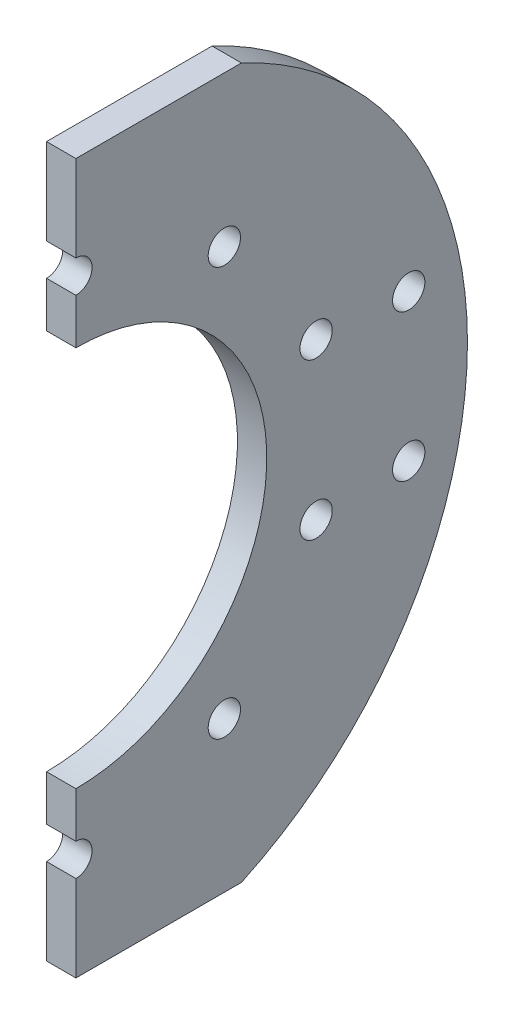
ISO-10303-21;
HEADER;
FILE_DESCRIPTION(('STEP AP214'),'2;1');
FILE_NAME('part.step','',(''),(''),'','','');
FILE_SCHEMA(('AUTOMOTIVE_DESIGN { 1 0 10303 214 1 1 1 1 }'));
ENDSEC;
DATA;
#1=APPLICATION_CONTEXT('core data for automotive mechanical design processes');
#2=APPLICATION_PROTOCOL_DEFINITION('international standard','automotive_design',2000,#1);
#3=PRODUCT_CONTEXT('',#1,'mechanical');
#4=PRODUCT('Part','Part','',(#3));
#5=PRODUCT_RELATED_PRODUCT_CATEGORY('part','',(#4));
#6=PRODUCT_DEFINITION_FORMATION('','',#4);
#7=PRODUCT_DEFINITION_CONTEXT('part definition',#1,'design');
#8=PRODUCT_DEFINITION('design','',#6,#7);
#9=PRODUCT_DEFINITION_SHAPE('','',#8);
#10=(LENGTH_UNIT() NAMED_UNIT(*) SI_UNIT(.MILLI.,.METRE.));
#11=(NAMED_UNIT(*) PLANE_ANGLE_UNIT() SI_UNIT($,.RADIAN.));
#12=(NAMED_UNIT(*) SI_UNIT($,.STERADIAN.) SOLID_ANGLE_UNIT());
#13=UNCERTAINTY_MEASURE_WITH_UNIT(LENGTH_MEASURE(1.E-05),#10,'distance_accuracy_value','');
#14=(GEOMETRIC_REPRESENTATION_CONTEXT(3) GLOBAL_UNCERTAINTY_ASSIGNED_CONTEXT((#13)) GLOBAL_UNIT_ASSIGNED_CONTEXT((#10,
#11,#12)) REPRESENTATION_CONTEXT('',''));
#15=CARTESIAN_POINT('',(0.,0.,0.));
#16=DIRECTION('',(0.,0.,1.));
#17=DIRECTION('',(1.,0.,0.));
#18=AXIS2_PLACEMENT_3D('',#15,#16,#17);
#19=CARTESIAN_POINT('',(0.,0.,0.));
#20=DIRECTION('',(0.,0.,1.));
#21=DIRECTION('',(1.,0.,0.));
#22=AXIS2_PLACEMENT_3D('',#19,#20,#21);
#23=PLANE('',#22);
#24=DIRECTION('',(0.,-1.,0.));
#25=VECTOR('',#24,1.);
#26=CARTESIAN_POINT('',(6.,0.,0.));
#27=LINE('',#26,#25);
#28=CARTESIAN_POINT('',(6.,72.5,0.));
#29=VERTEX_POINT('',#28);
#30=CARTESIAN_POINT('',(6.,54.9,0.));
#31=VERTEX_POINT('',#30);
#32=EDGE_CURVE('E73',#29,#31,#27,.T.);
#33=ORIENTED_EDGE('',*,*,#32,.F.);
#34=DIRECTION('',(1.,0.,0.));
#35=VECTOR('',#34,1.);
#36=CARTESIAN_POINT('',(6.,72.5,0.));
#37=LINE('',#36,#35);
#38=CARTESIAN_POINT('',(0.,72.5,0.));
#39=VERTEX_POINT('',#38);
#40=EDGE_CURVE('E139',#39,#29,#37,.T.);
#41=ORIENTED_EDGE('',*,*,#40,.F.);
#42=DIRECTION('',(0.,-1.,0.));
#43=VECTOR('',#42,1.);
#44=CARTESIAN_POINT('',(0.,0.,0.));
#45=LINE('',#44,#43);
#46=CARTESIAN_POINT('',(0.,54.9,0.));
#47=VERTEX_POINT('',#46);
#48=EDGE_CURVE('E123',#39,#47,#45,.T.);
#49=ORIENTED_EDGE('',*,*,#48,.T.);
#50=DIRECTION('',(-1.,0.,0.));
#51=VECTOR('',#50,1.);
#52=CARTESIAN_POINT('',(6.,54.9,0.));
#53=LINE('',#52,#51);
#54=EDGE_CURVE('E131',#31,#47,#53,.T.);
#55=ORIENTED_EDGE('',*,*,#54,.F.);
#56=EDGE_LOOP('',(#33,#41,#49,#55));
#57=FACE_BOUND('',#56,.T.);
#58=ADVANCED_FACE('F34',(#57),#23,.T.);
#59=CARTESIAN_POINT('',(6.,48.3,0.));
#60=VERTEX_POINT('',#59);
#61=CARTESIAN_POINT('',(6.,39.,0.));
#62=VERTEX_POINT('',#61);
#63=EDGE_CURVE('E234',#60,#62,#27,.T.);
#64=ORIENTED_EDGE('',*,*,#63,.F.);
#65=DIRECTION('',(-1.,0.,0.));
#66=VECTOR('',#65,1.);
#67=CARTESIAN_POINT('',(6.,48.3,0.));
#68=LINE('',#67,#66);
#69=CARTESIAN_POINT('',(0.,48.3,0.));
#70=VERTEX_POINT('',#69);
#71=EDGE_CURVE('E135',#70,#60,#68,.F.);
#72=ORIENTED_EDGE('',*,*,#71,.F.);
#73=CARTESIAN_POINT('',(0.,39.,0.));
#74=VERTEX_POINT('',#73);
#75=EDGE_CURVE('E125',#70,#74,#45,.T.);
#76=ORIENTED_EDGE('',*,*,#75,.T.);
#77=DIRECTION('',(-1.,0.,0.));
#78=VECTOR('',#77,1.);
#79=CARTESIAN_POINT('',(6.,39.,0.));
#80=LINE('',#79,#78);
#81=EDGE_CURVE('E173',#62,#74,#80,.T.);
#82=ORIENTED_EDGE('',*,*,#81,.F.);
#83=EDGE_LOOP('',(#64,#72,#76,#82));
#84=FACE_BOUND('',#83,.T.);
#85=ADVANCED_FACE('F240',(#84),#23,.T.);
#86=CARTESIAN_POINT('',(6.,-39.,0.));
#87=VERTEX_POINT('',#86);
#88=CARTESIAN_POINT('',(6.,-48.3,0.));
#89=VERTEX_POINT('',#88);
#90=EDGE_CURVE('E239',#87,#89,#27,.T.);
#91=ORIENTED_EDGE('',*,*,#90,.F.);
#92=DIRECTION('',(-1.,0.,0.));
#93=VECTOR('',#92,1.);
#94=CARTESIAN_POINT('',(6.,-39.,0.));
#95=LINE('',#94,#93);
#96=CARTESIAN_POINT('',(0.,-39.,0.));
#97=VERTEX_POINT('',#96);
#98=EDGE_CURVE('E161',#97,#87,#95,.F.);
#99=ORIENTED_EDGE('',*,*,#98,.F.);
#100=CARTESIAN_POINT('',(0.,-48.3,0.));
#101=VERTEX_POINT('',#100);
#102=EDGE_CURVE('E145',#97,#101,#45,.T.);
#103=ORIENTED_EDGE('',*,*,#102,.T.);
#104=DIRECTION('',(-1.,0.,0.));
#105=VECTOR('',#104,1.);
#106=CARTESIAN_POINT('',(6.,-48.3,0.));
#107=LINE('',#106,#105);
#108=EDGE_CURVE('E158',#89,#101,#107,.T.);
#109=ORIENTED_EDGE('',*,*,#108,.F.);
#110=EDGE_LOOP('',(#91,#99,#103,#109));
#111=FACE_BOUND('',#110,.T.);
#112=ADVANCED_FACE('F156',(#111),#23,.T.);
#113=CARTESIAN_POINT('',(6.,-54.9,0.));
#114=VERTEX_POINT('',#113);
#115=CARTESIAN_POINT('',(6.,-72.5,0.));
#116=VERTEX_POINT('',#115);
#117=EDGE_CURVE('E235',#114,#116,#27,.T.);
#118=ORIENTED_EDGE('',*,*,#117,.F.);
#119=DIRECTION('',(-1.,0.,0.));
#120=VECTOR('',#119,1.);
#121=CARTESIAN_POINT('',(6.,-54.9,0.));
#122=LINE('',#121,#120);
#123=CARTESIAN_POINT('',(0.,-54.9,0.));
#124=VERTEX_POINT('',#123);
#125=EDGE_CURVE('E136',#124,#114,#122,.F.);
#126=ORIENTED_EDGE('',*,*,#125,.F.);
#127=CARTESIAN_POINT('',(0.,-72.5,0.));
#128=VERTEX_POINT('',#127);
#129=EDGE_CURVE('E142',#124,#128,#45,.T.);
#130=ORIENTED_EDGE('',*,*,#129,.T.);
#131=DIRECTION('',(1.,0.,0.));
#132=VECTOR('',#131,1.);
#133=CARTESIAN_POINT('',(6.,-72.5,0.));
#134=LINE('',#133,#132);
#135=EDGE_CURVE('E140',#128,#116,#134,.T.);
#136=ORIENTED_EDGE('',*,*,#135,.T.);
#137=EDGE_LOOP('',(#118,#126,#130,#136));
#138=FACE_BOUND('',#137,.T.);
#139=ADVANCED_FACE('F254',(#138),#23,.T.);
#140=CARTESIAN_POINT('',(6.,-72.5,0.));
#141=DIRECTION('',(0.,1.,0.));
#142=DIRECTION('',(0.,0.,1.));
#143=AXIS2_PLACEMENT_3D('',#140,#141,#142);
#144=PLANE('',#143);
#145=ORIENTED_EDGE('',*,*,#135,.F.);
#146=DIRECTION('',(0.,0.,-1.));
#147=VECTOR('',#146,1.);
#148=CARTESIAN_POINT('',(0.,-72.5,0.));
#149=LINE('',#148,#147);
#150=CARTESIAN_POINT('',(0.,-72.5,-33.8193731461717));
#151=VERTEX_POINT('',#150);
#152=EDGE_CURVE('E53',#128,#151,#149,.T.);
#153=ORIENTED_EDGE('',*,*,#152,.T.);
#154=DIRECTION('',(-1.,0.,0.));
#155=VECTOR('',#154,1.);
#156=CARTESIAN_POINT('',(6.,-72.5,-33.8193731461717));
#157=LINE('',#156,#155);
#158=CARTESIAN_POINT('',(6.,-72.5,-33.8193731461717));
#159=VERTEX_POINT('',#158);
#160=EDGE_CURVE('E185',#159,#151,#157,.T.);
#161=ORIENTED_EDGE('',*,*,#160,.F.);
#162=DIRECTION('',(0.,0.,-1.));
#163=VECTOR('',#162,1.);
#164=CARTESIAN_POINT('',(6.,-72.5,0.));
#165=LINE('',#164,#163);
#166=EDGE_CURVE('E183',#116,#159,#165,.T.);
#167=ORIENTED_EDGE('',*,*,#166,.F.);
#168=EDGE_LOOP('',(#145,#153,#161,#167));
#169=FACE_BOUND('',#168,.T.);
#170=ADVANCED_FACE('F250',(#169),#144,.F.);
#171=CARTESIAN_POINT('',(6.,72.5,0.));
#172=DIRECTION('',(0.,1.,0.));
#173=DIRECTION('',(0.,0.,1.));
#174=AXIS2_PLACEMENT_3D('',#171,#172,#173);
#175=PLANE('',#174);
#176=DIRECTION('',(0.,0.,-1.));
#177=VECTOR('',#176,1.);
#178=CARTESIAN_POINT('',(0.,72.5,0.));
#179=LINE('',#178,#177);
#180=CARTESIAN_POINT('',(0.,72.5,-33.8193731461717));
#181=VERTEX_POINT('',#180);
#182=EDGE_CURVE('E178',#39,#181,#179,.T.);
#183=ORIENTED_EDGE('',*,*,#182,.F.);
#184=ORIENTED_EDGE('',*,*,#40,.T.);
#185=DIRECTION('',(0.,0.,-1.));
#186=VECTOR('',#185,1.);
#187=CARTESIAN_POINT('',(6.,72.5,0.));
#188=LINE('',#187,#186);
#189=CARTESIAN_POINT('',(6.,72.5,-33.8193731461717));
#190=VERTEX_POINT('',#189);
#191=EDGE_CURVE('E65',#29,#190,#188,.T.);
#192=ORIENTED_EDGE('',*,*,#191,.T.);
#193=DIRECTION('',(-1.,0.,0.));
#194=VECTOR('',#193,1.);
#195=CARTESIAN_POINT('',(6.,72.5,-33.8193731461717));
#196=LINE('',#195,#194);
#197=EDGE_CURVE('E182',#190,#181,#196,.T.);
#198=ORIENTED_EDGE('',*,*,#197,.T.);
#199=EDGE_LOOP('',(#183,#184,#192,#198));
#200=FACE_BOUND('',#199,.T.);
#201=ADVANCED_FACE('F177',(#200),#175,.T.);
#202=CARTESIAN_POINT('',(6.,0.,0.));
#203=DIRECTION('',(-1.,0.,0.));
#204=DIRECTION('',(0.,0.,1.));
#205=AXIS2_PLACEMENT_3D('',#202,#203,#204);
#206=CYLINDRICAL_SURFACE('',#205,39.);
#207=CARTESIAN_POINT('',(6.,0.,0.));
#208=DIRECTION('',(1.,0.,0.));
#209=DIRECTION('',(0.,0.,-1.));
#210=AXIS2_PLACEMENT_3D('',#207,#208,#209);
#211=CIRCLE('',#210,39.);
#212=EDGE_CURVE('E189',#87,#62,#211,.T.);
#213=ORIENTED_EDGE('',*,*,#212,.T.);
#214=ORIENTED_EDGE('',*,*,#81,.T.);
#215=CARTESIAN_POINT('',(0.,0.,0.));
#216=DIRECTION('',(1.,0.,0.));
#217=DIRECTION('',(0.,0.,-1.));
#218=AXIS2_PLACEMENT_3D('',#215,#216,#217);
#219=CIRCLE('',#218,39.);
#220=EDGE_CURVE('E162',#97,#74,#219,.T.);
#221=ORIENTED_EDGE('',*,*,#220,.F.);
#222=ORIENTED_EDGE('',*,*,#98,.T.);
#223=EDGE_LOOP('',(#213,#214,#221,#222));
#224=FACE_BOUND('',#223,.T.);
#225=ADVANCED_FACE('F242',(#224),#206,.F.);
#226=CARTESIAN_POINT('',(6.,-51.6,0.));
#227=DIRECTION('',(-1.,0.,0.));
#228=DIRECTION('',(0.,0.,1.));
#229=AXIS2_PLACEMENT_3D('',#226,#227,#228);
#230=CYLINDRICAL_SURFACE('',#229,3.29999999999999);
#231=CARTESIAN_POINT('',(6.,-51.6,0.));
#232=DIRECTION('',(1.,0.,0.));
#233=DIRECTION('',(0.,0.,-1.));
#234=AXIS2_PLACEMENT_3D('',#231,#232,#233);
#235=CIRCLE('',#234,3.29999999999999);
#236=EDGE_CURVE('E170',#114,#89,#235,.T.);
#237=ORIENTED_EDGE('',*,*,#236,.T.);
#238=ORIENTED_EDGE('',*,*,#108,.T.);
#239=CARTESIAN_POINT('',(0.,-51.6,0.));
#240=DIRECTION('',(1.,0.,0.));
#241=DIRECTION('',(0.,0.,-1.));
#242=AXIS2_PLACEMENT_3D('',#239,#240,#241);
#243=CIRCLE('',#242,3.29999999999999);
#244=EDGE_CURVE('E164',#124,#101,#243,.T.);
#245=ORIENTED_EDGE('',*,*,#244,.F.);
#246=ORIENTED_EDGE('',*,*,#125,.T.);
#247=EDGE_LOOP('',(#237,#238,#245,#246));
#248=FACE_BOUND('',#247,.T.);
#249=ADVANCED_FACE('F168',(#248),#230,.F.);
#250=CARTESIAN_POINT('',(6.,51.6,0.));
#251=DIRECTION('',(-1.,0.,0.));
#252=DIRECTION('',(0.,0.,1.));
#253=AXIS2_PLACEMENT_3D('',#250,#251,#252);
#254=CYLINDRICAL_SURFACE('',#253,3.3);
#255=CARTESIAN_POINT('',(6.,51.6,0.));
#256=DIRECTION('',(1.,0.,0.));
#257=DIRECTION('',(0.,0.,-1.));
#258=AXIS2_PLACEMENT_3D('',#255,#256,#257);
#259=CIRCLE('',#258,3.3);
#260=EDGE_CURVE('E133',#60,#31,#259,.T.);
#261=ORIENTED_EDGE('',*,*,#260,.T.);
#262=ORIENTED_EDGE('',*,*,#54,.T.);
#263=CARTESIAN_POINT('',(0.,51.6,0.));
#264=DIRECTION('',(1.,0.,0.));
#265=DIRECTION('',(0.,0.,-1.));
#266=AXIS2_PLACEMENT_3D('',#263,#264,#265);
#267=CIRCLE('',#266,3.3);
#268=EDGE_CURVE('E38',#70,#47,#267,.T.);
#269=ORIENTED_EDGE('',*,*,#268,.F.);
#270=ORIENTED_EDGE('',*,*,#71,.T.);
#271=EDGE_LOOP('',(#261,#262,#269,#270));
#272=FACE_BOUND('',#271,.T.);
#273=ADVANCED_FACE('F132',(#272),#254,.F.);
#274=CARTESIAN_POINT('',(6.,0.,0.));
#275=DIRECTION('',(1.,0.,0.));
#276=DIRECTION('',(0.,0.,-1.));
#277=AXIS2_PLACEMENT_3D('',#274,#275,#276);
#278=PLANE('',#277);
#279=CARTESIAN_POINT('',(6.,-41.7452769097473,-30.3297190182916));
#280=DIRECTION('',(1.,0.,0.));
#281=DIRECTION('',(0.,0.,-1.));
#282=AXIS2_PLACEMENT_3D('',#279,#280,#281);
#283=CIRCLE('',#282,3.3);
#284=CARTESIAN_POINT('',(6.,-41.7452769097473,-33.6297190182916));
#285=VERTEX_POINT('',#284);
#286=EDGE_CURVE('E193',#285,#285,#283,.T.);
#287=ORIENTED_EDGE('',*,*,#286,.F.);
#288=EDGE_LOOP('',(#287));
#289=FACE_BOUND('',#288,.T.);
#290=CARTESIAN_POINT('',(6.,-15.9452769097473,-49.0745162408299));
#291=DIRECTION('',(1.,0.,0.));
#292=DIRECTION('',(0.,0.,-1.));
#293=AXIS2_PLACEMENT_3D('',#290,#291,#292);
#294=CIRCLE('',#293,3.3);
#295=CARTESIAN_POINT('',(6.,-15.9452769097473,-52.3745162408299));
#296=VERTEX_POINT('',#295);
#297=EDGE_CURVE('E221',#296,#296,#294,.T.);
#298=ORIENTED_EDGE('',*,*,#297,.F.);
#299=EDGE_LOOP('',(#298));
#300=FACE_BOUND('',#299,.T.);
#301=CARTESIAN_POINT('',(6.,15.9452769097473,-49.0745162408299));
#302=DIRECTION('',(1.,0.,0.));
#303=DIRECTION('',(0.,0.,-1.));
#304=AXIS2_PLACEMENT_3D('',#301,#302,#303);
#305=CIRCLE('',#304,3.3);
#306=CARTESIAN_POINT('',(6.,15.9452769097473,-52.3745162408299));
#307=VERTEX_POINT('',#306);
#308=EDGE_CURVE('E224',#307,#307,#305,.T.);
#309=ORIENTED_EDGE('',*,*,#308,.F.);
#310=EDGE_LOOP('',(#309));
#311=FACE_BOUND('',#310,.T.);
#312=CARTESIAN_POINT('',(6.,41.7452769097473,-30.3297190182916));
#313=DIRECTION('',(1.,0.,0.));
#314=DIRECTION('',(0.,0.,-1.));
#315=AXIS2_PLACEMENT_3D('',#312,#313,#314);
#316=CIRCLE('',#315,3.30000000000004);
#317=CARTESIAN_POINT('',(6.,41.7452769097473,-33.6297190182917));
#318=VERTEX_POINT('',#317);
#319=EDGE_CURVE('E196',#318,#318,#316,.T.);
#320=ORIENTED_EDGE('',*,*,#319,.F.);
#321=EDGE_LOOP('',(#320));
#322=FACE_BOUND('',#321,.T.);
#323=CARTESIAN_POINT('',(6.,15.,-68.));
#324=DIRECTION('',(1.,0.,0.));
#325=DIRECTION('',(0.,0.,-1.));
#326=AXIS2_PLACEMENT_3D('',#323,#324,#325);
#327=CIRCLE('',#326,3.30000000000001);
#328=CARTESIAN_POINT('',(6.,15.,-71.3));
#329=VERTEX_POINT('',#328);
#330=EDGE_CURVE('E195',#329,#329,#327,.T.);
#331=ORIENTED_EDGE('',*,*,#330,.F.);
#332=EDGE_LOOP('',(#331));
#333=FACE_BOUND('',#332,.T.);
#334=CARTESIAN_POINT('',(6.,-15.,-68.));
#335=DIRECTION('',(1.,0.,0.));
#336=DIRECTION('',(0.,0.,-1.));
#337=AXIS2_PLACEMENT_3D('',#334,#335,#336);
#338=CIRCLE('',#337,3.3);
#339=CARTESIAN_POINT('',(6.,-15.,-71.3));
#340=VERTEX_POINT('',#339);
#341=EDGE_CURVE('E199',#340,#340,#338,.T.);
#342=ORIENTED_EDGE('',*,*,#341,.F.);
#343=EDGE_LOOP('',(#342));
#344=FACE_BOUND('',#343,.T.);
#345=ORIENTED_EDGE('',*,*,#191,.F.);
#346=ORIENTED_EDGE('',*,*,#32,.T.);
#347=ORIENTED_EDGE('',*,*,#260,.F.);
#348=ORIENTED_EDGE('',*,*,#63,.T.);
#349=ORIENTED_EDGE('',*,*,#212,.F.);
#350=ORIENTED_EDGE('',*,*,#90,.T.);
#351=ORIENTED_EDGE('',*,*,#236,.F.);
#352=ORIENTED_EDGE('',*,*,#117,.T.);
#353=ORIENTED_EDGE('',*,*,#166,.T.);
#354=CARTESIAN_POINT('',(6.,0.,0.));
#355=DIRECTION('',(1.,0.,0.));
#356=DIRECTION('',(0.,0.,-1.));
#357=AXIS2_PLACEMENT_3D('',#354,#355,#356);
#358=CIRCLE('',#357,80.);
#359=EDGE_CURVE('E180',#159,#190,#358,.T.);
#360=ORIENTED_EDGE('',*,*,#359,.T.);
#361=EDGE_LOOP('',(#345,#346,#347,#348,#349,#350,#351,#352,#353,#360));
#362=FACE_BOUND('',#361,.T.);
#363=ADVANCED_FACE('F36',(#289,#300,#311,#322,#333,#344,#362),#278,.T.);
#364=CARTESIAN_POINT('',(0.,0.,0.));
#365=DIRECTION('',(1.,0.,0.));
#366=DIRECTION('',(0.,0.,-1.));
#367=AXIS2_PLACEMENT_3D('',#364,#365,#366);
#368=PLANE('',#367);
#369=CARTESIAN_POINT('',(0.,-41.7452769097473,-30.3297190182916));
#370=DIRECTION('',(1.,0.,0.));
#371=DIRECTION('',(0.,0.,-1.));
#372=AXIS2_PLACEMENT_3D('',#369,#370,#371);
#373=CIRCLE('',#372,3.3);
#374=CARTESIAN_POINT('',(0.,-41.7452769097473,-33.6297190182916));
#375=VERTEX_POINT('',#374);
#376=EDGE_CURVE('E167',#375,#375,#373,.T.);
#377=ORIENTED_EDGE('',*,*,#376,.T.);
#378=EDGE_LOOP('',(#377));
#379=FACE_BOUND('',#378,.T.);
#380=CARTESIAN_POINT('',(0.,-15.9452769097473,-49.0745162408299));
#381=DIRECTION('',(1.,0.,0.));
#382=DIRECTION('',(0.,0.,-1.));
#383=AXIS2_PLACEMENT_3D('',#380,#381,#382);
#384=CIRCLE('',#383,3.3);
#385=CARTESIAN_POINT('',(0.,-15.9452769097473,-52.3745162408299));
#386=VERTEX_POINT('',#385);
#387=EDGE_CURVE('E209',#386,#386,#384,.T.);
#388=ORIENTED_EDGE('',*,*,#387,.T.);
#389=EDGE_LOOP('',(#388));
#390=FACE_BOUND('',#389,.T.);
#391=CARTESIAN_POINT('',(0.,15.9452769097473,-49.0745162408299));
#392=DIRECTION('',(1.,0.,0.));
#393=DIRECTION('',(0.,0.,-1.));
#394=AXIS2_PLACEMENT_3D('',#391,#392,#393);
#395=CIRCLE('',#394,3.3);
#396=CARTESIAN_POINT('',(0.,15.9452769097473,-52.3745162408299));
#397=VERTEX_POINT('',#396);
#398=EDGE_CURVE('E212',#397,#397,#395,.T.);
#399=ORIENTED_EDGE('',*,*,#398,.T.);
#400=EDGE_LOOP('',(#399));
#401=FACE_BOUND('',#400,.T.);
#402=CARTESIAN_POINT('',(0.,41.7452769097473,-30.3297190182916));
#403=DIRECTION('',(1.,0.,0.));
#404=DIRECTION('',(0.,0.,-1.));
#405=AXIS2_PLACEMENT_3D('',#402,#403,#404);
#406=CIRCLE('',#405,3.30000000000004);
#407=CARTESIAN_POINT('',(0.,41.7452769097473,-33.6297190182917));
#408=VERTEX_POINT('',#407);
#409=EDGE_CURVE('E129',#408,#408,#406,.T.);
#410=ORIENTED_EDGE('',*,*,#409,.T.);
#411=EDGE_LOOP('',(#410));
#412=FACE_BOUND('',#411,.T.);
#413=CARTESIAN_POINT('',(0.,15.,-68.));
#414=DIRECTION('',(1.,0.,0.));
#415=DIRECTION('',(0.,0.,-1.));
#416=AXIS2_PLACEMENT_3D('',#413,#414,#415);
#417=CIRCLE('',#416,3.30000000000001);
#418=CARTESIAN_POINT('',(0.,15.,-71.3));
#419=VERTEX_POINT('',#418);
#420=EDGE_CURVE('E44',#419,#419,#417,.T.);
#421=ORIENTED_EDGE('',*,*,#420,.T.);
#422=EDGE_LOOP('',(#421));
#423=FACE_BOUND('',#422,.T.);
#424=CARTESIAN_POINT('',(0.,-15.,-68.));
#425=DIRECTION('',(1.,0.,0.));
#426=DIRECTION('',(0.,0.,-1.));
#427=AXIS2_PLACEMENT_3D('',#424,#425,#426);
#428=CIRCLE('',#427,3.3);
#429=CARTESIAN_POINT('',(0.,-15.,-71.3));
#430=VERTEX_POINT('',#429);
#431=EDGE_CURVE('E11',#430,#430,#428,.T.);
#432=ORIENTED_EDGE('',*,*,#431,.T.);
#433=EDGE_LOOP('',(#432));
#434=FACE_BOUND('',#433,.T.);
#435=ORIENTED_EDGE('',*,*,#48,.F.);
#436=ORIENTED_EDGE('',*,*,#182,.T.);
#437=CARTESIAN_POINT('',(0.,0.,0.));
#438=DIRECTION('',(1.,0.,0.));
#439=DIRECTION('',(0.,0.,-1.));
#440=AXIS2_PLACEMENT_3D('',#437,#438,#439);
#441=CIRCLE('',#440,80.);
#442=EDGE_CURVE('E198',#151,#181,#441,.T.);
#443=ORIENTED_EDGE('',*,*,#442,.F.);
#444=ORIENTED_EDGE('',*,*,#152,.F.);
#445=ORIENTED_EDGE('',*,*,#129,.F.);
#446=ORIENTED_EDGE('',*,*,#244,.T.);
#447=ORIENTED_EDGE('',*,*,#102,.F.);
#448=ORIENTED_EDGE('',*,*,#220,.T.);
#449=ORIENTED_EDGE('',*,*,#75,.F.);
#450=ORIENTED_EDGE('',*,*,#268,.T.);
#451=EDGE_LOOP('',(#435,#436,#443,#444,#445,#446,#447,#448,#449,#450));
#452=FACE_BOUND('',#451,.T.);
#453=ADVANCED_FACE('F121',(#379,#390,#401,#412,#423,#434,#452),#368,.F.);
#454=CARTESIAN_POINT('',(6.,0.,0.));
#455=DIRECTION('',(-1.,0.,0.));
#456=DIRECTION('',(0.,0.,1.));
#457=AXIS2_PLACEMENT_3D('',#454,#455,#456);
#458=CYLINDRICAL_SURFACE('',#457,80.);
#459=ORIENTED_EDGE('',*,*,#442,.T.);
#460=ORIENTED_EDGE('',*,*,#197,.F.);
#461=ORIENTED_EDGE('',*,*,#359,.F.);
#462=ORIENTED_EDGE('',*,*,#160,.T.);
#463=EDGE_LOOP('',(#459,#460,#461,#462));
#464=FACE_BOUND('',#463,.T.);
#465=ADVANCED_FACE('F263',(#464),#458,.T.);
#466=CARTESIAN_POINT('',(6.,-41.7452769097473,-30.3297190182916));
#467=DIRECTION('',(-1.,0.,0.));
#468=DIRECTION('',(0.,0.,1.));
#469=AXIS2_PLACEMENT_3D('',#466,#467,#468);
#470=CYLINDRICAL_SURFACE('',#469,3.3);
#471=ORIENTED_EDGE('',*,*,#286,.T.);
#472=EDGE_LOOP('',(#471));
#473=FACE_BOUND('',#472,.T.);
#474=ORIENTED_EDGE('',*,*,#376,.F.);
#475=EDGE_LOOP('',(#474));
#476=FACE_BOUND('',#475,.T.);
#477=ADVANCED_FACE('F266',(#473,#476),#470,.F.);
#478=CARTESIAN_POINT('',(6.,-15.9452769097473,-49.0745162408299));
#479=DIRECTION('',(-1.,0.,0.));
#480=DIRECTION('',(0.,0.,1.));
#481=AXIS2_PLACEMENT_3D('',#478,#479,#480);
#482=CYLINDRICAL_SURFACE('',#481,3.3);
#483=ORIENTED_EDGE('',*,*,#297,.T.);
#484=EDGE_LOOP('',(#483));
#485=FACE_BOUND('',#484,.T.);
#486=ORIENTED_EDGE('',*,*,#387,.F.);
#487=EDGE_LOOP('',(#486));
#488=FACE_BOUND('',#487,.T.);
#489=ADVANCED_FACE('F269',(#485,#488),#482,.F.);
#490=CARTESIAN_POINT('',(6.,15.9452769097473,-49.0745162408299));
#491=DIRECTION('',(-1.,0.,0.));
#492=DIRECTION('',(0.,0.,1.));
#493=AXIS2_PLACEMENT_3D('',#490,#491,#492);
#494=CYLINDRICAL_SURFACE('',#493,3.3);
#495=ORIENTED_EDGE('',*,*,#308,.T.);
#496=EDGE_LOOP('',(#495));
#497=FACE_BOUND('',#496,.T.);
#498=ORIENTED_EDGE('',*,*,#398,.F.);
#499=EDGE_LOOP('',(#498));
#500=FACE_BOUND('',#499,.T.);
#501=ADVANCED_FACE('F273',(#497,#500),#494,.F.);
#502=CARTESIAN_POINT('',(6.,41.7452769097473,-30.3297190182916));
#503=DIRECTION('',(-1.,0.,0.));
#504=DIRECTION('',(0.,0.,1.));
#505=AXIS2_PLACEMENT_3D('',#502,#503,#504);
#506=CYLINDRICAL_SURFACE('',#505,3.30000000000004);
#507=ORIENTED_EDGE('',*,*,#319,.T.);
#508=EDGE_LOOP('',(#507));
#509=FACE_BOUND('',#508,.T.);
#510=ORIENTED_EDGE('',*,*,#409,.F.);
#511=EDGE_LOOP('',(#510));
#512=FACE_BOUND('',#511,.T.);
#513=ADVANCED_FACE('F277',(#509,#512),#506,.F.);
#514=CARTESIAN_POINT('',(6.,15.,-68.));
#515=DIRECTION('',(-1.,0.,0.));
#516=DIRECTION('',(0.,0.,1.));
#517=AXIS2_PLACEMENT_3D('',#514,#515,#516);
#518=CYLINDRICAL_SURFACE('',#517,3.30000000000001);
#519=ORIENTED_EDGE('',*,*,#330,.T.);
#520=EDGE_LOOP('',(#519));
#521=FACE_BOUND('',#520,.T.);
#522=ORIENTED_EDGE('',*,*,#420,.F.);
#523=EDGE_LOOP('',(#522));
#524=FACE_BOUND('',#523,.T.);
#525=ADVANCED_FACE('F281',(#521,#524),#518,.F.);
#526=CARTESIAN_POINT('',(6.,-15.,-68.));
#527=DIRECTION('',(-1.,0.,0.));
#528=DIRECTION('',(0.,0.,1.));
#529=AXIS2_PLACEMENT_3D('',#526,#527,#528);
#530=CYLINDRICAL_SURFACE('',#529,3.3);
#531=ORIENTED_EDGE('',*,*,#341,.T.);
#532=EDGE_LOOP('',(#531));
#533=FACE_BOUND('',#532,.T.);
#534=ORIENTED_EDGE('',*,*,#431,.F.);
#535=EDGE_LOOP('',(#534));
#536=FACE_BOUND('',#535,.T.);
#537=ADVANCED_FACE('F260',(#533,#536),#530,.F.);
#538=CLOSED_SHELL('',(#58,#85,#112,#139,#170,#201,#225,#249,#273,#363,#453,#465,#477,#489,#501,
#513,#525,#537));
#539=MANIFOLD_SOLID_BREP('B2',#538);
#540=ADVANCED_BREP_SHAPE_REPRESENTATION('',(#18,#539),#14);
#541=SHAPE_DEFINITION_REPRESENTATION(#9,#540);
ENDSEC;
END-ISO-10303-21;
